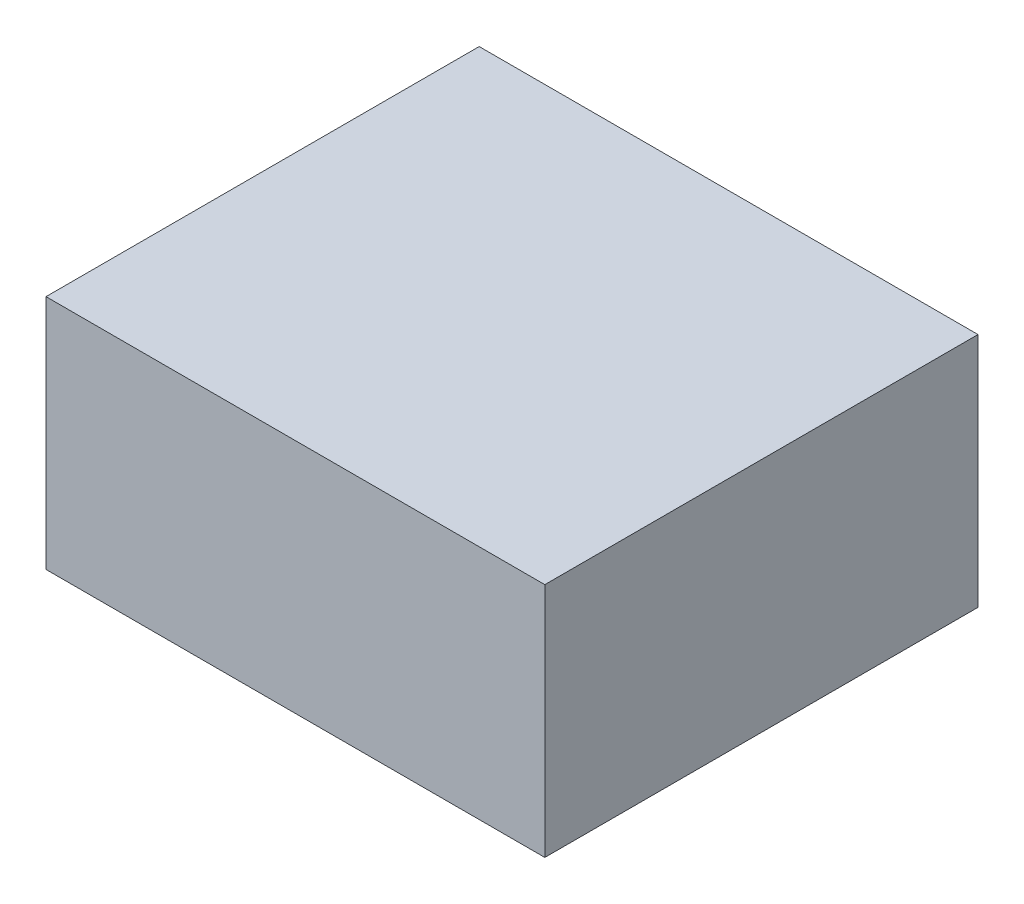
ISO-10303-21;
HEADER;
FILE_DESCRIPTION(('STEP AP214'),'2;1');
FILE_NAME('part.step','',(''),(''),'','','');
FILE_SCHEMA(('AUTOMOTIVE_DESIGN { 1 0 10303 214 1 1 1 1 }'));
ENDSEC;
DATA;
#1=APPLICATION_CONTEXT('core data for automotive mechanical design processes');
#2=APPLICATION_PROTOCOL_DEFINITION('international standard','automotive_design',2000,#1);
#3=PRODUCT_CONTEXT('',#1,'mechanical');
#4=PRODUCT('Part','Part','',(#3));
#5=PRODUCT_RELATED_PRODUCT_CATEGORY('part','',(#4));
#6=PRODUCT_DEFINITION_FORMATION('','',#4);
#7=PRODUCT_DEFINITION_CONTEXT('part definition',#1,'design');
#8=PRODUCT_DEFINITION('design','',#6,#7);
#9=PRODUCT_DEFINITION_SHAPE('','',#8);
#10=(LENGTH_UNIT() NAMED_UNIT(*) SI_UNIT(.MILLI.,.METRE.));
#11=(NAMED_UNIT(*) PLANE_ANGLE_UNIT() SI_UNIT($,.RADIAN.));
#12=(NAMED_UNIT(*) SI_UNIT($,.STERADIAN.) SOLID_ANGLE_UNIT());
#13=UNCERTAINTY_MEASURE_WITH_UNIT(LENGTH_MEASURE(1.E-05),#10,'distance_accuracy_value','');
#14=(GEOMETRIC_REPRESENTATION_CONTEXT(3) GLOBAL_UNCERTAINTY_ASSIGNED_CONTEXT((#13)) GLOBAL_UNIT_ASSIGNED_CONTEXT((#10,
#11,#12)) REPRESENTATION_CONTEXT('',''));
#15=CARTESIAN_POINT('',(0.,0.,0.));
#16=DIRECTION('',(0.,0.,1.));
#17=DIRECTION('',(1.,0.,0.));
#18=AXIS2_PLACEMENT_3D('',#15,#16,#17);
#19=CARTESIAN_POINT('',(0.,18.,0.));
#20=DIRECTION('',(1.,0.,0.));
#21=DIRECTION('',(0.,0.,-1.));
#22=AXIS2_PLACEMENT_3D('',#19,#20,#21);
#23=PLANE('',#22);
#24=DIRECTION('',(0.,0.,1.));
#25=VECTOR('',#24,1.);
#26=CARTESIAN_POINT('',(0.,0.,0.));
#27=LINE('',#26,#25);
#28=CARTESIAN_POINT('',(0.,0.,0.));
#29=VERTEX_POINT('',#28);
#30=CARTESIAN_POINT('',(0.,0.,33.));
#31=VERTEX_POINT('',#30);
#32=EDGE_CURVE('E106',#29,#31,#27,.T.);
#33=ORIENTED_EDGE('',*,*,#32,.T.);
#34=DIRECTION('',(0.,-1.,0.));
#35=VECTOR('',#34,1.);
#36=CARTESIAN_POINT('',(0.,18.,33.));
#37=LINE('',#36,#35);
#38=CARTESIAN_POINT('',(0.,18.,33.));
#39=VERTEX_POINT('',#38);
#40=EDGE_CURVE('E11',#39,#31,#37,.T.);
#41=ORIENTED_EDGE('',*,*,#40,.F.);
#42=DIRECTION('',(0.,0.,1.));
#43=VECTOR('',#42,1.);
#44=CARTESIAN_POINT('',(0.,18.,0.));
#45=LINE('',#44,#43);
#46=CARTESIAN_POINT('',(0.,18.,0.));
#47=VERTEX_POINT('',#46);
#48=EDGE_CURVE('E94',#47,#39,#45,.T.);
#49=ORIENTED_EDGE('',*,*,#48,.F.);
#50=DIRECTION('',(0.,-1.,0.));
#51=VECTOR('',#50,1.);
#52=CARTESIAN_POINT('',(0.,18.,0.));
#53=LINE('',#52,#51);
#54=EDGE_CURVE('E102',#47,#29,#53,.T.);
#55=ORIENTED_EDGE('',*,*,#54,.T.);
#56=EDGE_LOOP('',(#33,#41,#49,#55));
#57=FACE_BOUND('',#56,.T.);
#58=ADVANCED_FACE('F43',(#57),#23,.F.);
#59=CARTESIAN_POINT('',(0.,18.,33.));
#60=DIRECTION('',(0.,0.,-1.));
#61=DIRECTION('',(-1.,0.,0.));
#62=AXIS2_PLACEMENT_3D('',#59,#60,#61);
#63=PLANE('',#62);
#64=DIRECTION('',(1.,0.,0.));
#65=VECTOR('',#64,1.);
#66=CARTESIAN_POINT('',(0.,0.,33.));
#67=LINE('',#66,#65);
#68=CARTESIAN_POINT('',(38.,0.,33.));
#69=VERTEX_POINT('',#68);
#70=EDGE_CURVE('E98',#31,#69,#67,.T.);
#71=ORIENTED_EDGE('',*,*,#70,.T.);
#72=DIRECTION('',(0.,-1.,0.));
#73=VECTOR('',#72,1.);
#74=CARTESIAN_POINT('',(38.,18.,33.));
#75=LINE('',#74,#73);
#76=CARTESIAN_POINT('',(38.,18.,33.));
#77=VERTEX_POINT('',#76);
#78=EDGE_CURVE('E51',#77,#69,#75,.T.);
#79=ORIENTED_EDGE('',*,*,#78,.F.);
#80=DIRECTION('',(1.,0.,0.));
#81=VECTOR('',#80,1.);
#82=CARTESIAN_POINT('',(0.,18.,33.));
#83=LINE('',#82,#81);
#84=EDGE_CURVE('E89',#39,#77,#83,.T.);
#85=ORIENTED_EDGE('',*,*,#84,.F.);
#86=ORIENTED_EDGE('',*,*,#40,.T.);
#87=EDGE_LOOP('',(#71,#79,#85,#86));
#88=FACE_BOUND('',#87,.T.);
#89=ADVANCED_FACE('F97',(#88),#63,.F.);
#90=CARTESIAN_POINT('',(38.,18.,0.));
#91=DIRECTION('',(-1.,0.,0.));
#92=DIRECTION('',(0.,0.,1.));
#93=AXIS2_PLACEMENT_3D('',#90,#91,#92);
#94=PLANE('',#93);
#95=DIRECTION('',(0.,0.,-1.));
#96=VECTOR('',#95,1.);
#97=CARTESIAN_POINT('',(38.,0.,0.));
#98=LINE('',#97,#96);
#99=CARTESIAN_POINT('',(38.,0.,0.));
#100=VERTEX_POINT('',#99);
#101=EDGE_CURVE('E76',#69,#100,#98,.T.);
#102=ORIENTED_EDGE('',*,*,#101,.T.);
#103=DIRECTION('',(0.,-1.,0.));
#104=VECTOR('',#103,1.);
#105=CARTESIAN_POINT('',(38.,18.,0.));
#106=LINE('',#105,#104);
#107=CARTESIAN_POINT('',(38.,18.,0.));
#108=VERTEX_POINT('',#107);
#109=EDGE_CURVE('E99',#108,#100,#106,.T.);
#110=ORIENTED_EDGE('',*,*,#109,.F.);
#111=DIRECTION('',(0.,0.,-1.));
#112=VECTOR('',#111,1.);
#113=CARTESIAN_POINT('',(38.,18.,0.));
#114=LINE('',#113,#112);
#115=EDGE_CURVE('E92',#77,#108,#114,.T.);
#116=ORIENTED_EDGE('',*,*,#115,.F.);
#117=ORIENTED_EDGE('',*,*,#78,.T.);
#118=EDGE_LOOP('',(#102,#110,#116,#117));
#119=FACE_BOUND('',#118,.T.);
#120=ADVANCED_FACE('F100',(#119),#94,.F.);
#121=CARTESIAN_POINT('',(0.,18.,0.));
#122=DIRECTION('',(0.,0.,1.));
#123=DIRECTION('',(1.,0.,0.));
#124=AXIS2_PLACEMENT_3D('',#121,#122,#123);
#125=PLANE('',#124);
#126=DIRECTION('',(-1.,0.,0.));
#127=VECTOR('',#126,1.);
#128=CARTESIAN_POINT('',(0.,0.,0.));
#129=LINE('',#128,#127);
#130=EDGE_CURVE('E82',#100,#29,#129,.T.);
#131=ORIENTED_EDGE('',*,*,#130,.T.);
#132=ORIENTED_EDGE('',*,*,#54,.F.);
#133=DIRECTION('',(-1.,0.,0.));
#134=VECTOR('',#133,1.);
#135=CARTESIAN_POINT('',(0.,18.,0.));
#136=LINE('',#135,#134);
#137=EDGE_CURVE('E59',#108,#47,#136,.T.);
#138=ORIENTED_EDGE('',*,*,#137,.F.);
#139=ORIENTED_EDGE('',*,*,#109,.T.);
#140=EDGE_LOOP('',(#131,#132,#138,#139));
#141=FACE_BOUND('',#140,.T.);
#142=ADVANCED_FACE('F113',(#141),#125,.F.);
#143=CARTESIAN_POINT('',(0.,18.,0.));
#144=DIRECTION('',(0.,1.,0.));
#145=DIRECTION('',(0.,0.,1.));
#146=AXIS2_PLACEMENT_3D('',#143,#144,#145);
#147=PLANE('',#146);
#148=ORIENTED_EDGE('',*,*,#48,.T.);
#149=ORIENTED_EDGE('',*,*,#84,.T.);
#150=ORIENTED_EDGE('',*,*,#115,.T.);
#151=ORIENTED_EDGE('',*,*,#137,.T.);
#152=EDGE_LOOP('',(#148,#149,#150,#151));
#153=FACE_BOUND('',#152,.T.);
#154=ADVANCED_FACE('F90',(#153),#147,.T.);
#155=CARTESIAN_POINT('',(0.,0.,0.));
#156=DIRECTION('',(0.,1.,0.));
#157=DIRECTION('',(0.,0.,1.));
#158=AXIS2_PLACEMENT_3D('',#155,#156,#157);
#159=PLANE('',#158);
#160=ORIENTED_EDGE('',*,*,#32,.F.);
#161=ORIENTED_EDGE('',*,*,#130,.F.);
#162=ORIENTED_EDGE('',*,*,#101,.F.);
#163=ORIENTED_EDGE('',*,*,#70,.F.);
#164=EDGE_LOOP('',(#160,#161,#162,#163));
#165=FACE_BOUND('',#164,.T.);
#166=ADVANCED_FACE('F116',(#165),#159,.F.);
#167=CLOSED_SHELL('',(#58,#89,#120,#142,#154,#166));
#168=MANIFOLD_SOLID_BREP('B2',#167);
#169=ADVANCED_BREP_SHAPE_REPRESENTATION('',(#18,#168),#14);
#170=SHAPE_DEFINITION_REPRESENTATION(#9,#169);
ENDSEC;
END-ISO-10303-21;
